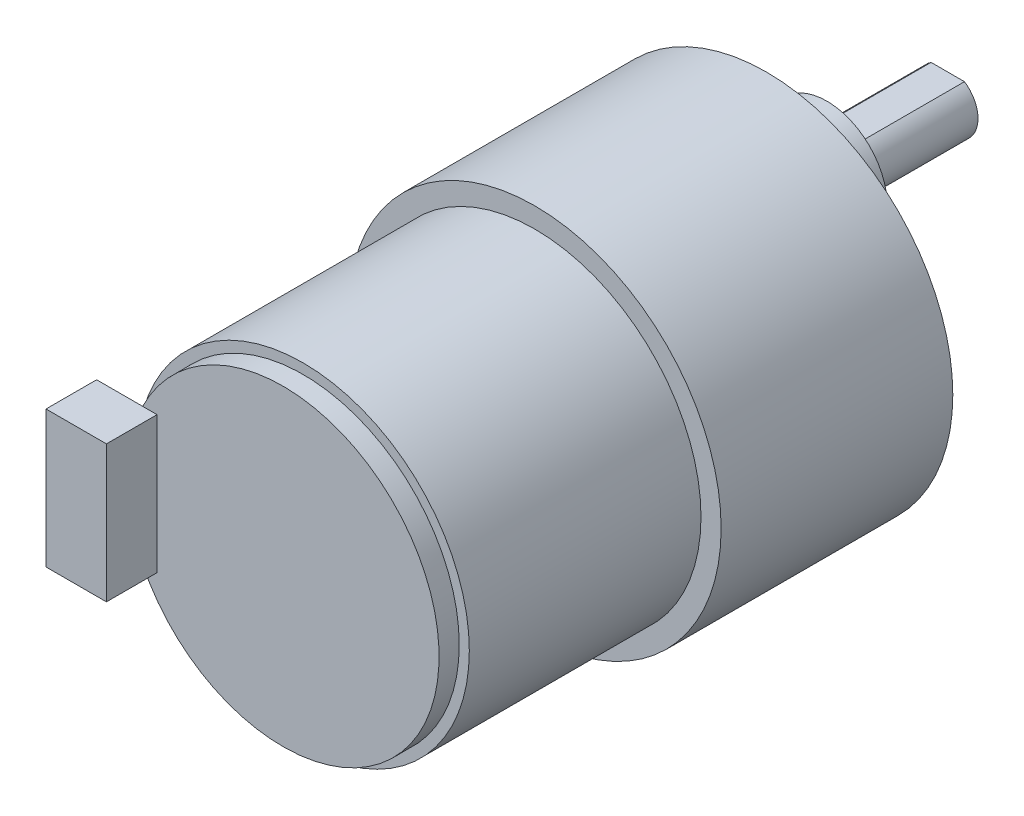
ISO-10303-21;
HEADER;
FILE_DESCRIPTION(('STEP AP214'),'2;1');
FILE_NAME('part.step','',(''),(''),'','','');
FILE_SCHEMA(('AUTOMOTIVE_DESIGN { 1 0 10303 214 1 1 1 1 }'));
ENDSEC;
DATA;
#1=APPLICATION_CONTEXT('core data for automotive mechanical design processes');
#2=APPLICATION_PROTOCOL_DEFINITION('international standard','automotive_design',2000,#1);
#3=PRODUCT_CONTEXT('',#1,'mechanical');
#4=PRODUCT('Part','Part','',(#3));
#5=PRODUCT_RELATED_PRODUCT_CATEGORY('part','',(#4));
#6=PRODUCT_DEFINITION_FORMATION('','',#4);
#7=PRODUCT_DEFINITION_CONTEXT('part definition',#1,'design');
#8=PRODUCT_DEFINITION('design','',#6,#7);
#9=PRODUCT_DEFINITION_SHAPE('','',#8);
#10=(LENGTH_UNIT() NAMED_UNIT(*) SI_UNIT(.MILLI.,.METRE.));
#11=(NAMED_UNIT(*) PLANE_ANGLE_UNIT() SI_UNIT($,.RADIAN.));
#12=(NAMED_UNIT(*) SI_UNIT($,.STERADIAN.) SOLID_ANGLE_UNIT());
#13=UNCERTAINTY_MEASURE_WITH_UNIT(LENGTH_MEASURE(1.E-05),#10,'distance_accuracy_value','');
#14=(GEOMETRIC_REPRESENTATION_CONTEXT(3) GLOBAL_UNCERTAINTY_ASSIGNED_CONTEXT((#13)) GLOBAL_UNIT_ASSIGNED_CONTEXT((#10,
#11,#12)) REPRESENTATION_CONTEXT('',''));
#15=CARTESIAN_POINT('',(0.,0.,0.));
#16=DIRECTION('',(0.,0.,1.));
#17=DIRECTION('',(1.,0.,0.));
#18=AXIS2_PLACEMENT_3D('',#15,#16,#17);
#19=CARTESIAN_POINT('',(0.,0.,2.));
#20=DIRECTION('',(0.,0.,1.));
#21=DIRECTION('',(1.,0.,0.));
#22=AXIS2_PLACEMENT_3D('',#19,#20,#21);
#23=PLANE('',#22);
#24=DIRECTION('',(0.,1.,0.));
#25=VECTOR('',#24,1.);
#26=CARTESIAN_POINT('',(-12.5,-6.7929235261488,2.));
#27=LINE('',#26,#25);
#28=CARTESIAN_POINT('',(-12.5,-6.7929235261488,2.));
#29=VERTEX_POINT('',#28);
#30=CARTESIAN_POINT('',(-12.5,6.7929235261488,2.));
#31=VERTEX_POINT('',#30);
#32=EDGE_CURVE('E56',#29,#31,#27,.T.);
#33=ORIENTED_EDGE('',*,*,#32,.F.);
#34=DIRECTION('',(-1.,0.,0.));
#35=VECTOR('',#34,1.);
#36=CARTESIAN_POINT('',(-12.5,-6.7929235261488,2.));
#37=LINE('',#36,#35);
#38=CARTESIAN_POINT('',(-13.9321997533733,-6.7929235261488,2.));
#39=VERTEX_POINT('',#38);
#40=EDGE_CURVE('E61',#29,#39,#37,.T.);
#41=ORIENTED_EDGE('',*,*,#40,.T.);
#42=CARTESIAN_POINT('',(0.,0.,2.));
#43=DIRECTION('',(0.,0.,1.));
#44=DIRECTION('',(1.,0.,0.));
#45=AXIS2_PLACEMENT_3D('',#42,#43,#44);
#46=CIRCLE('',#45,15.5);
#47=CARTESIAN_POINT('',(-13.9321997533733,6.7929235261488,2.));
#48=VERTEX_POINT('',#47);
#49=EDGE_CURVE('E155',#39,#48,#46,.T.);
#50=ORIENTED_EDGE('',*,*,#49,.T.);
#51=DIRECTION('',(-1.,0.,0.));
#52=VECTOR('',#51,1.);
#53=CARTESIAN_POINT('',(-12.5,6.7929235261488,2.));
#54=LINE('',#53,#52);
#55=EDGE_CURVE('E143',#31,#48,#54,.T.);
#56=ORIENTED_EDGE('',*,*,#55,.F.);
#57=EDGE_LOOP('',(#33,#41,#50,#56));
#58=FACE_BOUND('',#57,.T.);
#59=ADVANCED_FACE('F40',(#58),#23,.T.);
#60=CARTESIAN_POINT('',(0.,0.,-23.));
#61=DIRECTION('',(0.,0.,1.));
#62=DIRECTION('',(1.,0.,0.));
#63=AXIS2_PLACEMENT_3D('',#60,#61,#62);
#64=CYLINDRICAL_SURFACE('',#63,16.5);
#65=CARTESIAN_POINT('',(0.,0.,-23.));
#66=DIRECTION('',(0.,0.,1.));
#67=DIRECTION('',(1.,0.,0.));
#68=AXIS2_PLACEMENT_3D('',#65,#66,#67);
#69=CIRCLE('',#68,16.5);
#70=CARTESIAN_POINT('',(16.5,0.,-23.));
#71=VERTEX_POINT('',#70);
#72=EDGE_CURVE('E244',#71,#71,#69,.T.);
#73=ORIENTED_EDGE('',*,*,#72,.T.);
#74=EDGE_LOOP('',(#73));
#75=FACE_BOUND('',#74,.T.);
#76=CARTESIAN_POINT('',(0.,0.,0.));
#77=DIRECTION('',(0.,0.,1.));
#78=DIRECTION('',(1.,0.,0.));
#79=AXIS2_PLACEMENT_3D('',#76,#77,#78);
#80=CIRCLE('',#79,16.5);
#81=CARTESIAN_POINT('',(16.5,0.,0.));
#82=VERTEX_POINT('',#81);
#83=EDGE_CURVE('E44',#82,#82,#80,.T.);
#84=ORIENTED_EDGE('',*,*,#83,.F.);
#85=EDGE_LOOP('',(#84));
#86=FACE_BOUND('',#85,.T.);
#87=ADVANCED_FACE('F42',(#75,#86),#64,.T.);
#88=CARTESIAN_POINT('',(0.,0.,0.));
#89=DIRECTION('',(0.,0.,1.));
#90=DIRECTION('',(1.,0.,0.));
#91=AXIS2_PLACEMENT_3D('',#88,#89,#90);
#92=PLANE('',#91);
#93=CARTESIAN_POINT('',(0.,0.,0.));
#94=DIRECTION('',(0.,0.,1.));
#95=DIRECTION('',(1.,0.,0.));
#96=AXIS2_PLACEMENT_3D('',#93,#94,#95);
#97=CIRCLE('',#96,15.5);
#98=CARTESIAN_POINT('',(15.5,0.,0.));
#99=VERTEX_POINT('',#98);
#100=EDGE_CURVE('E11',#99,#99,#97,.T.);
#101=ORIENTED_EDGE('',*,*,#100,.F.);
#102=EDGE_LOOP('',(#101));
#103=FACE_BOUND('',#102,.T.);
#104=ORIENTED_EDGE('',*,*,#83,.T.);
#105=EDGE_LOOP('',(#104));
#106=FACE_BOUND('',#105,.T.);
#107=ADVANCED_FACE('F252',(#103,#106),#92,.T.);
#108=CARTESIAN_POINT('',(0.,0.,-46.));
#109=DIRECTION('',(0.,0.,1.));
#110=DIRECTION('',(1.,0.,0.));
#111=AXIS2_PLACEMENT_3D('',#108,#109,#110);
#112=CYLINDRICAL_SURFACE('',#111,18.5);
#113=CARTESIAN_POINT('',(0.,0.,-46.));
#114=DIRECTION('',(0.,0.,-1.));
#115=DIRECTION('',(-1.,0.,0.));
#116=AXIS2_PLACEMENT_3D('',#113,#114,#115);
#117=CIRCLE('',#116,18.5);
#118=CARTESIAN_POINT('',(-18.5,0.,-46.));
#119=VERTEX_POINT('',#118);
#120=EDGE_CURVE('E241',#119,#119,#117,.T.);
#121=ORIENTED_EDGE('',*,*,#120,.F.);
#122=EDGE_LOOP('',(#121));
#123=FACE_BOUND('',#122,.T.);
#124=CARTESIAN_POINT('',(0.,0.,-23.));
#125=DIRECTION('',(0.,0.,-1.));
#126=DIRECTION('',(-1.,0.,0.));
#127=AXIS2_PLACEMENT_3D('',#124,#125,#126);
#128=CIRCLE('',#127,18.5);
#129=CARTESIAN_POINT('',(-18.5,0.,-23.));
#130=VERTEX_POINT('',#129);
#131=EDGE_CURVE('E238',#130,#130,#128,.T.);
#132=ORIENTED_EDGE('',*,*,#131,.T.);
#133=EDGE_LOOP('',(#132));
#134=FACE_BOUND('',#133,.T.);
#135=ADVANCED_FACE('F259',(#123,#134),#112,.T.);
#136=CARTESIAN_POINT('',(0.,0.,-46.));
#137=DIRECTION('',(0.,0.,-1.));
#138=DIRECTION('',(-1.,0.,0.));
#139=AXIS2_PLACEMENT_3D('',#136,#137,#138);
#140=PLANE('',#139);
#141=CARTESIAN_POINT('',(-7.75000000000016,-13.4233937586587,-46.));
#142=DIRECTION('',(0.,0.,-1.));
#143=DIRECTION('',(-1.,0.,0.));
#144=AXIS2_PLACEMENT_3D('',#141,#142,#143);
#145=CIRCLE('',#144,1.525);
#146=CARTESIAN_POINT('',(-9.27500000000016,-13.4233937586587,-46.));
#147=VERTEX_POINT('',#146);
#148=EDGE_CURVE('E162',#147,#147,#145,.T.);
#149=ORIENTED_EDGE('',*,*,#148,.F.);
#150=EDGE_LOOP('',(#149));
#151=FACE_BOUND('',#150,.T.);
#152=CARTESIAN_POINT('',(7.74999999999987,-13.4233937586589,-46.));
#153=DIRECTION('',(0.,0.,-1.));
#154=DIRECTION('',(-1.,0.,0.));
#155=AXIS2_PLACEMENT_3D('',#152,#153,#154);
#156=CIRCLE('',#155,1.525);
#157=CARTESIAN_POINT('',(6.22499999999987,-13.4233937586589,-46.));
#158=VERTEX_POINT('',#157);
#159=EDGE_CURVE('E172',#158,#158,#156,.T.);
#160=ORIENTED_EDGE('',*,*,#159,.F.);
#161=EDGE_LOOP('',(#160));
#162=FACE_BOUND('',#161,.T.);
#163=CARTESIAN_POINT('',(15.5,0.,-46.));
#164=DIRECTION('',(0.,0.,-1.));
#165=DIRECTION('',(-1.,0.,0.));
#166=AXIS2_PLACEMENT_3D('',#163,#164,#165);
#167=CIRCLE('',#166,1.525);
#168=CARTESIAN_POINT('',(13.975,0.,-46.));
#169=VERTEX_POINT('',#168);
#170=EDGE_CURVE('E181',#169,#169,#167,.T.);
#171=ORIENTED_EDGE('',*,*,#170,.F.);
#172=EDGE_LOOP('',(#171));
#173=FACE_BOUND('',#172,.T.);
#174=CARTESIAN_POINT('',(7.75000000000006,13.4233937586588,-46.));
#175=DIRECTION('',(0.,0.,-1.));
#176=DIRECTION('',(-1.,0.,0.));
#177=AXIS2_PLACEMENT_3D('',#174,#175,#176);
#178=CIRCLE('',#177,1.525);
#179=CARTESIAN_POINT('',(6.22500000000006,13.4233937586588,-46.));
#180=VERTEX_POINT('',#179);
#181=EDGE_CURVE('E190',#180,#180,#178,.T.);
#182=ORIENTED_EDGE('',*,*,#181,.F.);
#183=EDGE_LOOP('',(#182));
#184=FACE_BOUND('',#183,.T.);
#185=CARTESIAN_POINT('',(-7.74999999999997,13.4233937586588,-46.));
#186=DIRECTION('',(0.,0.,-1.));
#187=DIRECTION('',(-1.,0.,0.));
#188=AXIS2_PLACEMENT_3D('',#185,#186,#187);
#189=CIRCLE('',#188,1.525);
#190=CARTESIAN_POINT('',(-9.27499999999997,13.4233937586588,-46.));
#191=VERTEX_POINT('',#190);
#192=EDGE_CURVE('E199',#191,#191,#189,.T.);
#193=ORIENTED_EDGE('',*,*,#192,.F.);
#194=EDGE_LOOP('',(#193));
#195=FACE_BOUND('',#194,.T.);
#196=CARTESIAN_POINT('',(-15.5,0.,-46.));
#197=DIRECTION('',(0.,0.,-1.));
#198=DIRECTION('',(-1.,0.,0.));
#199=AXIS2_PLACEMENT_3D('',#196,#197,#198);
#200=CIRCLE('',#199,1.525);
#201=CARTESIAN_POINT('',(-17.025,0.,-46.));
#202=VERTEX_POINT('',#201);
#203=EDGE_CURVE('E208',#202,#202,#200,.T.);
#204=ORIENTED_EDGE('',*,*,#203,.F.);
#205=EDGE_LOOP('',(#204));
#206=FACE_BOUND('',#205,.T.);
#207=CARTESIAN_POINT('',(0.,7.,-46.));
#208=DIRECTION('',(0.,0.,-1.));
#209=DIRECTION('',(-1.,0.,0.));
#210=AXIS2_PLACEMENT_3D('',#207,#208,#209);
#211=CIRCLE('',#210,6.);
#212=CARTESIAN_POINT('',(-6.,7.,-46.));
#213=VERTEX_POINT('',#212);
#214=EDGE_CURVE('E234',#213,#213,#211,.T.);
#215=ORIENTED_EDGE('',*,*,#214,.F.);
#216=EDGE_LOOP('',(#215));
#217=FACE_BOUND('',#216,.T.);
#218=ORIENTED_EDGE('',*,*,#120,.T.);
#219=EDGE_LOOP('',(#218));
#220=FACE_BOUND('',#219,.T.);
#221=ADVANCED_FACE('F364',(#151,#162,#173,#184,#195,#206,#217,#220),#140,.T.);
#222=CARTESIAN_POINT('',(0.,0.,-23.));
#223=DIRECTION('',(0.,0.,-1.));
#224=DIRECTION('',(-1.,0.,0.));
#225=AXIS2_PLACEMENT_3D('',#222,#223,#224);
#226=PLANE('',#225);
#227=ORIENTED_EDGE('',*,*,#72,.F.);
#228=EDGE_LOOP('',(#227));
#229=FACE_BOUND('',#228,.T.);
#230=ORIENTED_EDGE('',*,*,#131,.F.);
#231=EDGE_LOOP('',(#230));
#232=FACE_BOUND('',#231,.T.);
#233=ADVANCED_FACE('F362',(#229,#232),#226,.F.);
#234=CARTESIAN_POINT('',(0.,7.,-52.));
#235=DIRECTION('',(0.,0.,1.));
#236=DIRECTION('',(1.,0.,0.));
#237=AXIS2_PLACEMENT_3D('',#234,#235,#236);
#238=CYLINDRICAL_SURFACE('',#237,6.);
#239=CARTESIAN_POINT('',(0.,7.,-52.));
#240=DIRECTION('',(0.,0.,-1.));
#241=DIRECTION('',(-1.,0.,0.));
#242=AXIS2_PLACEMENT_3D('',#239,#240,#241);
#243=CIRCLE('',#242,6.);
#244=CARTESIAN_POINT('',(-6.,7.,-52.));
#245=VERTEX_POINT('',#244);
#246=EDGE_CURVE('E235',#245,#245,#243,.T.);
#247=ORIENTED_EDGE('',*,*,#246,.F.);
#248=EDGE_LOOP('',(#247));
#249=FACE_BOUND('',#248,.T.);
#250=ORIENTED_EDGE('',*,*,#214,.T.);
#251=EDGE_LOOP('',(#250));
#252=FACE_BOUND('',#251,.T.);
#253=ADVANCED_FACE('F358',(#249,#252),#238,.T.);
#254=CARTESIAN_POINT('',(0.,7.,-52.));
#255=DIRECTION('',(0.,0.,-1.));
#256=DIRECTION('',(-1.,0.,0.));
#257=AXIS2_PLACEMENT_3D('',#254,#255,#256);
#258=PLANE('',#257);
#259=CARTESIAN_POINT('',(0.,7.,-52.));
#260=DIRECTION('',(0.,0.,-1.));
#261=DIRECTION('',(-1.,0.,0.));
#262=AXIS2_PLACEMENT_3D('',#259,#260,#261);
#263=CIRCLE('',#262,3.);
#264=CARTESIAN_POINT('',(1.6583123951777,9.5,-52.));
#265=VERTEX_POINT('',#264);
#266=CARTESIAN_POINT('',(-1.6583123951777,9.5,-52.));
#267=VERTEX_POINT('',#266);
#268=EDGE_CURVE('E217',#265,#267,#263,.T.);
#269=ORIENTED_EDGE('',*,*,#268,.F.);
#270=DIRECTION('',(1.,0.,0.));
#271=VECTOR('',#270,1.);
#272=CARTESIAN_POINT('',(1.6583123951777,9.5,-52.));
#273=LINE('',#272,#271);
#274=EDGE_CURVE('E222',#267,#265,#273,.T.);
#275=ORIENTED_EDGE('',*,*,#274,.F.);
#276=EDGE_LOOP('',(#269,#275));
#277=FACE_BOUND('',#276,.T.);
#278=ORIENTED_EDGE('',*,*,#246,.T.);
#279=EDGE_LOOP('',(#278));
#280=FACE_BOUND('',#279,.T.);
#281=ADVANCED_FACE('F354',(#277,#280),#258,.T.);
#282=CARTESIAN_POINT('',(0.,7.,-64.));
#283=DIRECTION('',(0.,0.,1.));
#284=DIRECTION('',(1.,0.,0.));
#285=AXIS2_PLACEMENT_3D('',#282,#283,#284);
#286=CYLINDRICAL_SURFACE('',#285,3.);
#287=ORIENTED_EDGE('',*,*,#268,.T.);
#288=DIRECTION('',(0.,0.,1.));
#289=VECTOR('',#288,1.);
#290=CARTESIAN_POINT('',(-1.6583123951777,9.5,-64.));
#291=LINE('',#290,#289);
#292=CARTESIAN_POINT('',(-1.6583123951777,9.5,-64.));
#293=VERTEX_POINT('',#292);
#294=EDGE_CURVE('E231',#293,#267,#291,.T.);
#295=ORIENTED_EDGE('',*,*,#294,.F.);
#296=CARTESIAN_POINT('',(0.,7.,-64.));
#297=DIRECTION('',(0.,0.,-1.));
#298=DIRECTION('',(-1.,0.,0.));
#299=AXIS2_PLACEMENT_3D('',#296,#297,#298);
#300=CIRCLE('',#299,3.);
#301=CARTESIAN_POINT('',(1.6583123951777,9.5,-64.));
#302=VERTEX_POINT('',#301);
#303=EDGE_CURVE('E218',#302,#293,#300,.T.);
#304=ORIENTED_EDGE('',*,*,#303,.F.);
#305=DIRECTION('',(0.,0.,1.));
#306=VECTOR('',#305,1.);
#307=CARTESIAN_POINT('',(1.6583123951777,9.5,-64.));
#308=LINE('',#307,#306);
#309=EDGE_CURVE('E224',#302,#265,#308,.T.);
#310=ORIENTED_EDGE('',*,*,#309,.T.);
#311=EDGE_LOOP('',(#287,#295,#304,#310));
#312=FACE_BOUND('',#311,.T.);
#313=ADVANCED_FACE('F350',(#312),#286,.T.);
#314=CARTESIAN_POINT('',(1.6583123951777,9.5,-64.));
#315=DIRECTION('',(0.,-1.,0.));
#316=DIRECTION('',(0.,0.,-1.));
#317=AXIS2_PLACEMENT_3D('',#314,#315,#316);
#318=PLANE('',#317);
#319=ORIENTED_EDGE('',*,*,#274,.T.);
#320=ORIENTED_EDGE('',*,*,#309,.F.);
#321=DIRECTION('',(1.,0.,0.));
#322=VECTOR('',#321,1.);
#323=CARTESIAN_POINT('',(1.6583123951777,9.5,-64.));
#324=LINE('',#323,#322);
#325=EDGE_CURVE('E221',#293,#302,#324,.T.);
#326=ORIENTED_EDGE('',*,*,#325,.F.);
#327=ORIENTED_EDGE('',*,*,#294,.T.);
#328=EDGE_LOOP('',(#319,#320,#326,#327));
#329=FACE_BOUND('',#328,.T.);
#330=ADVANCED_FACE('F346',(#329),#318,.F.);
#331=CARTESIAN_POINT('',(0.,7.,-64.));
#332=DIRECTION('',(0.,0.,-1.));
#333=DIRECTION('',(-1.,0.,0.));
#334=AXIS2_PLACEMENT_3D('',#331,#332,#333);
#335=PLANE('',#334);
#336=ORIENTED_EDGE('',*,*,#303,.T.);
#337=ORIENTED_EDGE('',*,*,#325,.T.);
#338=EDGE_LOOP('',(#336,#337));
#339=FACE_BOUND('',#338,.T.);
#340=ADVANCED_FACE('F342',(#339),#335,.T.);
#341=CARTESIAN_POINT('',(-15.5,0.,-35.9999946));
#342=DIRECTION('',(0.,0.,-1.));
#343=DIRECTION('',(-1.,0.,0.));
#344=AXIS2_PLACEMENT_3D('',#341,#342,#343);
#345=CONICAL_SURFACE('',#344,1.25,1.02974425867665);
#346=CARTESIAN_POINT('',(-15.5,0.,-35.2489188262155));
#347=VERTEX_POINT('',#346);
#348=VERTEX_LOOP('',#347);
#349=FACE_BOUND('',#348,.T.);
#350=CARTESIAN_POINT('',(-15.5,0.,-35.9999946));
#351=DIRECTION('',(0.,0.,-1.));
#352=DIRECTION('',(-1.,0.,0.));
#353=AXIS2_PLACEMENT_3D('',#350,#351,#352);
#354=CIRCLE('',#353,1.25);
#355=CARTESIAN_POINT('',(-16.75,0.,-35.9999946));
#356=VERTEX_POINT('',#355);
#357=EDGE_CURVE('E214',#356,#356,#354,.T.);
#358=ORIENTED_EDGE('',*,*,#357,.T.);
#359=EDGE_LOOP('',(#358));
#360=FACE_BOUND('',#359,.T.);
#361=ADVANCED_FACE('F338',(#349,#360),#345,.F.);
#362=CARTESIAN_POINT('',(-15.5,0.,-46.));
#363=DIRECTION('',(0.,0.,-1.));
#364=DIRECTION('',(-1.,0.,0.));
#365=AXIS2_PLACEMENT_3D('',#362,#363,#364);
#366=CYLINDRICAL_SURFACE('',#365,1.25);
#367=ORIENTED_EDGE('',*,*,#357,.F.);
#368=EDGE_LOOP('',(#367));
#369=FACE_BOUND('',#368,.T.);
#370=CARTESIAN_POINT('',(-15.5,0.,-45.725));
#371=DIRECTION('',(0.,0.,-1.));
#372=DIRECTION('',(-1.,0.,0.));
#373=AXIS2_PLACEMENT_3D('',#370,#371,#372);
#374=CIRCLE('',#373,1.25);
#375=CARTESIAN_POINT('',(-16.75,0.,-45.725));
#376=VERTEX_POINT('',#375);
#377=EDGE_CURVE('E211',#376,#376,#374,.T.);
#378=ORIENTED_EDGE('',*,*,#377,.T.);
#379=EDGE_LOOP('',(#378));
#380=FACE_BOUND('',#379,.T.);
#381=ADVANCED_FACE('F334',(#369,#380),#366,.F.);
#382=CARTESIAN_POINT('',(-15.5,0.,-46.));
#383=DIRECTION('',(0.,0.,-1.));
#384=DIRECTION('',(-1.,0.,0.));
#385=AXIS2_PLACEMENT_3D('',#382,#383,#384);
#386=CONICAL_SURFACE('',#385,1.525,0.785398163397458);
#387=ORIENTED_EDGE('',*,*,#377,.F.);
#388=EDGE_LOOP('',(#387));
#389=FACE_BOUND('',#388,.T.);
#390=ORIENTED_EDGE('',*,*,#203,.T.);
#391=EDGE_LOOP('',(#390));
#392=FACE_BOUND('',#391,.T.);
#393=ADVANCED_FACE('F330',(#389,#392),#386,.F.);
#394=CARTESIAN_POINT('',(-7.74999999999997,13.4233937586588,-35.9999946));
#395=DIRECTION('',(0.,0.,-1.));
#396=DIRECTION('',(-1.,0.,0.));
#397=AXIS2_PLACEMENT_3D('',#394,#395,#396);
#398=CONICAL_SURFACE('',#397,1.25,1.02974425867665);
#399=CARTESIAN_POINT('',(-7.74999999999997,13.4233937586588,-35.2489188262155));
#400=VERTEX_POINT('',#399);
#401=VERTEX_LOOP('',#400);
#402=FACE_BOUND('',#401,.T.);
#403=CARTESIAN_POINT('',(-7.74999999999997,13.4233937586588,-35.9999946));
#404=DIRECTION('',(0.,0.,-1.));
#405=DIRECTION('',(-1.,0.,0.));
#406=AXIS2_PLACEMENT_3D('',#403,#404,#405);
#407=CIRCLE('',#406,1.25);
#408=CARTESIAN_POINT('',(-8.99999999999997,13.4233937586588,-35.9999946));
#409=VERTEX_POINT('',#408);
#410=EDGE_CURVE('E205',#409,#409,#407,.T.);
#411=ORIENTED_EDGE('',*,*,#410,.T.);
#412=EDGE_LOOP('',(#411));
#413=FACE_BOUND('',#412,.T.);
#414=ADVANCED_FACE('F326',(#402,#413),#398,.F.);
#415=CARTESIAN_POINT('',(-7.74999999999997,13.4233937586588,-46.));
#416=DIRECTION('',(0.,0.,-1.));
#417=DIRECTION('',(-1.,0.,0.));
#418=AXIS2_PLACEMENT_3D('',#415,#416,#417);
#419=CYLINDRICAL_SURFACE('',#418,1.25);
#420=ORIENTED_EDGE('',*,*,#410,.F.);
#421=EDGE_LOOP('',(#420));
#422=FACE_BOUND('',#421,.T.);
#423=CARTESIAN_POINT('',(-7.74999999999997,13.4233937586588,-45.725));
#424=DIRECTION('',(0.,0.,-1.));
#425=DIRECTION('',(-1.,0.,0.));
#426=AXIS2_PLACEMENT_3D('',#423,#424,#425);
#427=CIRCLE('',#426,1.25);
#428=CARTESIAN_POINT('',(-8.99999999999997,13.4233937586588,-45.725));
#429=VERTEX_POINT('',#428);
#430=EDGE_CURVE('E202',#429,#429,#427,.T.);
#431=ORIENTED_EDGE('',*,*,#430,.T.);
#432=EDGE_LOOP('',(#431));
#433=FACE_BOUND('',#432,.T.);
#434=ADVANCED_FACE('F322',(#422,#433),#419,.F.);
#435=CARTESIAN_POINT('',(-7.74999999999997,13.4233937586588,-46.));
#436=DIRECTION('',(0.,0.,-1.));
#437=DIRECTION('',(-1.,0.,0.));
#438=AXIS2_PLACEMENT_3D('',#435,#436,#437);
#439=CONICAL_SURFACE('',#438,1.525,0.785398163397456);
#440=ORIENTED_EDGE('',*,*,#430,.F.);
#441=EDGE_LOOP('',(#440));
#442=FACE_BOUND('',#441,.T.);
#443=ORIENTED_EDGE('',*,*,#192,.T.);
#444=EDGE_LOOP('',(#443));
#445=FACE_BOUND('',#444,.T.);
#446=ADVANCED_FACE('F318',(#442,#445),#439,.F.);
#447=CARTESIAN_POINT('',(7.75000000000006,13.4233937586588,-35.9999946));
#448=DIRECTION('',(0.,0.,-1.));
#449=DIRECTION('',(-1.,0.,0.));
#450=AXIS2_PLACEMENT_3D('',#447,#448,#449);
#451=CONICAL_SURFACE('',#450,1.25,1.02974425867665);
#452=CARTESIAN_POINT('',(7.75000000000006,13.4233937586588,-35.2489188262155));
#453=VERTEX_POINT('',#452);
#454=VERTEX_LOOP('',#453);
#455=FACE_BOUND('',#454,.T.);
#456=CARTESIAN_POINT('',(7.75000000000006,13.4233937586588,-35.9999946));
#457=DIRECTION('',(0.,0.,-1.));
#458=DIRECTION('',(-1.,0.,0.));
#459=AXIS2_PLACEMENT_3D('',#456,#457,#458);
#460=CIRCLE('',#459,1.25);
#461=CARTESIAN_POINT('',(6.50000000000007,13.4233937586588,-35.9999946));
#462=VERTEX_POINT('',#461);
#463=EDGE_CURVE('E196',#462,#462,#460,.T.);
#464=ORIENTED_EDGE('',*,*,#463,.T.);
#465=EDGE_LOOP('',(#464));
#466=FACE_BOUND('',#465,.T.);
#467=ADVANCED_FACE('F314',(#455,#466),#451,.F.);
#468=CARTESIAN_POINT('',(7.75000000000006,13.4233937586588,-46.));
#469=DIRECTION('',(0.,0.,-1.));
#470=DIRECTION('',(-1.,0.,0.));
#471=AXIS2_PLACEMENT_3D('',#468,#469,#470);
#472=CYLINDRICAL_SURFACE('',#471,1.25);
#473=ORIENTED_EDGE('',*,*,#463,.F.);
#474=EDGE_LOOP('',(#473));
#475=FACE_BOUND('',#474,.T.);
#476=CARTESIAN_POINT('',(7.75000000000006,13.4233937586588,-45.725));
#477=DIRECTION('',(0.,0.,-1.));
#478=DIRECTION('',(-1.,0.,0.));
#479=AXIS2_PLACEMENT_3D('',#476,#477,#478);
#480=CIRCLE('',#479,1.25);
#481=CARTESIAN_POINT('',(6.50000000000006,13.4233937586588,-45.725));
#482=VERTEX_POINT('',#481);
#483=EDGE_CURVE('E193',#482,#482,#480,.T.);
#484=ORIENTED_EDGE('',*,*,#483,.T.);
#485=EDGE_LOOP('',(#484));
#486=FACE_BOUND('',#485,.T.);
#487=ADVANCED_FACE('F310',(#475,#486),#472,.F.);
#488=CARTESIAN_POINT('',(7.75000000000006,13.4233937586588,-46.));
#489=DIRECTION('',(0.,0.,-1.));
#490=DIRECTION('',(-1.,0.,0.));
#491=AXIS2_PLACEMENT_3D('',#488,#489,#490);
#492=CONICAL_SURFACE('',#491,1.525,0.785398163397458);
#493=ORIENTED_EDGE('',*,*,#483,.F.);
#494=EDGE_LOOP('',(#493));
#495=FACE_BOUND('',#494,.T.);
#496=ORIENTED_EDGE('',*,*,#181,.T.);
#497=EDGE_LOOP('',(#496));
#498=FACE_BOUND('',#497,.T.);
#499=ADVANCED_FACE('F306',(#495,#498),#492,.F.);
#500=CARTESIAN_POINT('',(15.5,0.,-35.9999946));
#501=DIRECTION('',(0.,0.,-1.));
#502=DIRECTION('',(-1.,0.,0.));
#503=AXIS2_PLACEMENT_3D('',#500,#501,#502);
#504=CONICAL_SURFACE('',#503,1.25,1.02974425867665);
#505=CARTESIAN_POINT('',(15.5,0.,-35.2489188262155));
#506=VERTEX_POINT('',#505);
#507=VERTEX_LOOP('',#506);
#508=FACE_BOUND('',#507,.T.);
#509=CARTESIAN_POINT('',(15.5,0.,-35.9999946));
#510=DIRECTION('',(0.,0.,-1.));
#511=DIRECTION('',(-1.,0.,0.));
#512=AXIS2_PLACEMENT_3D('',#509,#510,#511);
#513=CIRCLE('',#512,1.25);
#514=CARTESIAN_POINT('',(14.25,0.,-35.9999946));
#515=VERTEX_POINT('',#514);
#516=EDGE_CURVE('E187',#515,#515,#513,.T.);
#517=ORIENTED_EDGE('',*,*,#516,.T.);
#518=EDGE_LOOP('',(#517));
#519=FACE_BOUND('',#518,.T.);
#520=ADVANCED_FACE('F302',(#508,#519),#504,.F.);
#521=CARTESIAN_POINT('',(15.5,0.,-46.));
#522=DIRECTION('',(0.,0.,-1.));
#523=DIRECTION('',(-1.,0.,0.));
#524=AXIS2_PLACEMENT_3D('',#521,#522,#523);
#525=CYLINDRICAL_SURFACE('',#524,1.25);
#526=ORIENTED_EDGE('',*,*,#516,.F.);
#527=EDGE_LOOP('',(#526));
#528=FACE_BOUND('',#527,.T.);
#529=CARTESIAN_POINT('',(15.5,0.,-45.725));
#530=DIRECTION('',(0.,0.,-1.));
#531=DIRECTION('',(-1.,0.,0.));
#532=AXIS2_PLACEMENT_3D('',#529,#530,#531);
#533=CIRCLE('',#532,1.25);
#534=CARTESIAN_POINT('',(14.25,0.,-45.725));
#535=VERTEX_POINT('',#534);
#536=EDGE_CURVE('E184',#535,#535,#533,.T.);
#537=ORIENTED_EDGE('',*,*,#536,.T.);
#538=EDGE_LOOP('',(#537));
#539=FACE_BOUND('',#538,.T.);
#540=ADVANCED_FACE('F298',(#528,#539),#525,.F.);
#541=CARTESIAN_POINT('',(15.5,0.,-46.));
#542=DIRECTION('',(0.,0.,-1.));
#543=DIRECTION('',(-1.,0.,0.));
#544=AXIS2_PLACEMENT_3D('',#541,#542,#543);
#545=CONICAL_SURFACE('',#544,1.525,0.785398163397455);
#546=ORIENTED_EDGE('',*,*,#536,.F.);
#547=EDGE_LOOP('',(#546));
#548=FACE_BOUND('',#547,.T.);
#549=ORIENTED_EDGE('',*,*,#170,.T.);
#550=EDGE_LOOP('',(#549));
#551=FACE_BOUND('',#550,.T.);
#552=ADVANCED_FACE('F294',(#548,#551),#545,.F.);
#553=CARTESIAN_POINT('',(7.74999999999987,-13.4233937586589,-35.9999946));
#554=DIRECTION('',(0.,0.,-1.));
#555=DIRECTION('',(-1.,0.,0.));
#556=AXIS2_PLACEMENT_3D('',#553,#554,#555);
#557=CONICAL_SURFACE('',#556,1.25,1.02974425867665);
#558=CARTESIAN_POINT('',(7.74999999999987,-13.4233937586589,-35.2489188262155));
#559=VERTEX_POINT('',#558);
#560=VERTEX_LOOP('',#559);
#561=FACE_BOUND('',#560,.T.);
#562=CARTESIAN_POINT('',(7.74999999999987,-13.4233937586589,-35.9999946));
#563=DIRECTION('',(0.,0.,-1.));
#564=DIRECTION('',(-1.,0.,0.));
#565=AXIS2_PLACEMENT_3D('',#562,#563,#564);
#566=CIRCLE('',#565,1.25);
#567=CARTESIAN_POINT('',(6.49999999999988,-13.4233937586589,-35.9999946));
#568=VERTEX_POINT('',#567);
#569=EDGE_CURVE('E178',#568,#568,#566,.T.);
#570=ORIENTED_EDGE('',*,*,#569,.T.);
#571=EDGE_LOOP('',(#570));
#572=FACE_BOUND('',#571,.T.);
#573=ADVANCED_FACE('F290',(#561,#572),#557,.F.);
#574=CARTESIAN_POINT('',(7.74999999999987,-13.4233937586589,-46.));
#575=DIRECTION('',(0.,0.,-1.));
#576=DIRECTION('',(-1.,0.,0.));
#577=AXIS2_PLACEMENT_3D('',#574,#575,#576);
#578=CYLINDRICAL_SURFACE('',#577,1.25);
#579=ORIENTED_EDGE('',*,*,#569,.F.);
#580=EDGE_LOOP('',(#579));
#581=FACE_BOUND('',#580,.T.);
#582=CARTESIAN_POINT('',(7.74999999999987,-13.4233937586589,-45.725));
#583=DIRECTION('',(0.,0.,-1.));
#584=DIRECTION('',(-1.,0.,0.));
#585=AXIS2_PLACEMENT_3D('',#582,#583,#584);
#586=CIRCLE('',#585,1.25);
#587=CARTESIAN_POINT('',(6.49999999999988,-13.4233937586589,-45.725));
#588=VERTEX_POINT('',#587);
#589=EDGE_CURVE('E175',#588,#588,#586,.T.);
#590=ORIENTED_EDGE('',*,*,#589,.T.);
#591=EDGE_LOOP('',(#590));
#592=FACE_BOUND('',#591,.T.);
#593=ADVANCED_FACE('F286',(#581,#592),#578,.F.);
#594=CARTESIAN_POINT('',(7.74999999999987,-13.4233937586589,-46.));
#595=DIRECTION('',(0.,0.,-1.));
#596=DIRECTION('',(-1.,0.,0.));
#597=AXIS2_PLACEMENT_3D('',#594,#595,#596);
#598=CONICAL_SURFACE('',#597,1.525,0.785398163397458);
#599=ORIENTED_EDGE('',*,*,#589,.F.);
#600=EDGE_LOOP('',(#599));
#601=FACE_BOUND('',#600,.T.);
#602=ORIENTED_EDGE('',*,*,#159,.T.);
#603=EDGE_LOOP('',(#602));
#604=FACE_BOUND('',#603,.T.);
#605=ADVANCED_FACE('F282',(#601,#604),#598,.F.);
#606=CARTESIAN_POINT('',(-7.75000000000016,-13.4233937586587,-35.9999946));
#607=DIRECTION('',(0.,0.,-1.));
#608=DIRECTION('',(-1.,0.,0.));
#609=AXIS2_PLACEMENT_3D('',#606,#607,#608);
#610=CONICAL_SURFACE('',#609,1.25,1.02974425867665);
#611=CARTESIAN_POINT('',(-7.75000000000016,-13.4233937586587,-35.2489188262155));
#612=VERTEX_POINT('',#611);
#613=VERTEX_LOOP('',#612);
#614=FACE_BOUND('',#613,.T.);
#615=CARTESIAN_POINT('',(-7.75000000000016,-13.4233937586587,-35.9999946));
#616=DIRECTION('',(0.,0.,-1.));
#617=DIRECTION('',(-1.,0.,0.));
#618=AXIS2_PLACEMENT_3D('',#615,#616,#617);
#619=CIRCLE('',#618,1.25);
#620=CARTESIAN_POINT('',(-9.00000000000015,-13.4233937586587,-35.9999946));
#621=VERTEX_POINT('',#620);
#622=EDGE_CURVE('E169',#621,#621,#619,.T.);
#623=ORIENTED_EDGE('',*,*,#622,.T.);
#624=EDGE_LOOP('',(#623));
#625=FACE_BOUND('',#624,.T.);
#626=ADVANCED_FACE('F278',(#614,#625),#610,.F.);
#627=CARTESIAN_POINT('',(-7.75000000000016,-13.4233937586587,-46.));
#628=DIRECTION('',(0.,0.,-1.));
#629=DIRECTION('',(-1.,0.,0.));
#630=AXIS2_PLACEMENT_3D('',#627,#628,#629);
#631=CYLINDRICAL_SURFACE('',#630,1.25);
#632=ORIENTED_EDGE('',*,*,#622,.F.);
#633=EDGE_LOOP('',(#632));
#634=FACE_BOUND('',#633,.T.);
#635=CARTESIAN_POINT('',(-7.75000000000016,-13.4233937586587,-45.725));
#636=DIRECTION('',(0.,0.,-1.));
#637=DIRECTION('',(-1.,0.,0.));
#638=AXIS2_PLACEMENT_3D('',#635,#636,#637);
#639=CIRCLE('',#638,1.25);
#640=CARTESIAN_POINT('',(-9.00000000000016,-13.4233937586587,-45.725));
#641=VERTEX_POINT('',#640);
#642=EDGE_CURVE('E166',#641,#641,#639,.T.);
#643=ORIENTED_EDGE('',*,*,#642,.T.);
#644=EDGE_LOOP('',(#643));
#645=FACE_BOUND('',#644,.T.);
#646=ADVANCED_FACE('F274',(#634,#645),#631,.F.);
#647=CARTESIAN_POINT('',(-7.75000000000016,-13.4233937586587,-46.));
#648=DIRECTION('',(0.,0.,-1.));
#649=DIRECTION('',(-1.,0.,0.));
#650=AXIS2_PLACEMENT_3D('',#647,#648,#649);
#651=CONICAL_SURFACE('',#650,1.525,0.785398163397456);
#652=ORIENTED_EDGE('',*,*,#642,.F.);
#653=EDGE_LOOP('',(#652));
#654=FACE_BOUND('',#653,.T.);
#655=ORIENTED_EDGE('',*,*,#148,.T.);
#656=EDGE_LOOP('',(#655));
#657=FACE_BOUND('',#656,.T.);
#658=ADVANCED_FACE('F270',(#654,#657),#651,.F.);
#659=CARTESIAN_POINT('',(0.,0.,2.));
#660=DIRECTION('',(0.,0.,-1.));
#661=DIRECTION('',(-1.,0.,0.));
#662=AXIS2_PLACEMENT_3D('',#659,#660,#661);
#663=CYLINDRICAL_SURFACE('',#662,15.5);
#664=EDGE_CURVE('E160',#48,#39,#46,.T.);
#665=ORIENTED_EDGE('',*,*,#664,.F.);
#666=ORIENTED_EDGE('',*,*,#49,.F.);
#667=EDGE_LOOP('',(#665,#666));
#668=FACE_BOUND('',#667,.T.);
#669=ORIENTED_EDGE('',*,*,#100,.T.);
#670=EDGE_LOOP('',(#669));
#671=FACE_BOUND('',#670,.T.);
#672=ADVANCED_FACE('F267',(#668,#671),#663,.T.);
#673=CARTESIAN_POINT('',(-12.5,-6.7929235261488,7.02500011));
#674=DIRECTION('',(0.,-1.,0.));
#675=DIRECTION('',(0.,0.,-1.));
#676=AXIS2_PLACEMENT_3D('',#673,#674,#675);
#677=PLANE('',#676);
#678=ORIENTED_EDGE('',*,*,#40,.F.);
#679=DIRECTION('',(0.,0.,-1.));
#680=VECTOR('',#679,1.);
#681=CARTESIAN_POINT('',(-12.5,-6.7929235261488,7.02500011));
#682=LINE('',#681,#680);
#683=CARTESIAN_POINT('',(-12.5,-6.7929235261488,7.02500011));
#684=VERTEX_POINT('',#683);
#685=EDGE_CURVE('E140',#684,#29,#682,.T.);
#686=ORIENTED_EDGE('',*,*,#685,.F.);
#687=DIRECTION('',(-1.,0.,0.));
#688=VECTOR('',#687,1.);
#689=CARTESIAN_POINT('',(-12.5,-6.7929235261488,7.02500011));
#690=LINE('',#689,#688);
#691=CARTESIAN_POINT('',(-18.5,-6.7929235261488,7.02500011));
#692=VERTEX_POINT('',#691);
#693=EDGE_CURVE('E134',#684,#692,#690,.T.);
#694=ORIENTED_EDGE('',*,*,#693,.T.);
#695=DIRECTION('',(0.,0.,-1.));
#696=VECTOR('',#695,1.);
#697=CARTESIAN_POINT('',(-18.5,-6.7929235261488,7.02500011));
#698=LINE('',#697,#696);
#699=CARTESIAN_POINT('',(-18.5,-6.7929235261488,2.));
#700=VERTEX_POINT('',#699);
#701=EDGE_CURVE('E118',#692,#700,#698,.T.);
#702=ORIENTED_EDGE('',*,*,#701,.T.);
#703=EDGE_CURVE('E149',#39,#700,#37,.T.);
#704=ORIENTED_EDGE('',*,*,#703,.F.);
#705=EDGE_LOOP('',(#678,#686,#694,#702,#704));
#706=FACE_BOUND('',#705,.T.);
#707=ADVANCED_FACE('F139',(#706),#677,.T.);
#708=CARTESIAN_POINT('',(-12.5,-6.7929235261488,7.02500011));
#709=DIRECTION('',(-1.,0.,0.));
#710=DIRECTION('',(0.,0.,1.));
#711=AXIS2_PLACEMENT_3D('',#708,#709,#710);
#712=PLANE('',#711);
#713=ORIENTED_EDGE('',*,*,#32,.T.);
#714=DIRECTION('',(0.,0.,-1.));
#715=VECTOR('',#714,1.);
#716=CARTESIAN_POINT('',(-12.5,6.7929235261488,7.02500011));
#717=LINE('',#716,#715);
#718=CARTESIAN_POINT('',(-12.5,6.7929235261488,7.02500011));
#719=VERTEX_POINT('',#718);
#720=EDGE_CURVE('E156',#719,#31,#717,.T.);
#721=ORIENTED_EDGE('',*,*,#720,.F.);
#722=DIRECTION('',(0.,1.,0.));
#723=VECTOR('',#722,1.);
#724=CARTESIAN_POINT('',(-12.5,-6.7929235261488,7.02500011));
#725=LINE('',#724,#723);
#726=EDGE_CURVE('E129',#684,#719,#725,.T.);
#727=ORIENTED_EDGE('',*,*,#726,.F.);
#728=ORIENTED_EDGE('',*,*,#685,.T.);
#729=EDGE_LOOP('',(#713,#721,#727,#728));
#730=FACE_BOUND('',#729,.T.);
#731=ADVANCED_FACE('F494',(#730),#712,.F.);
#732=CARTESIAN_POINT('',(-12.5,6.7929235261488,7.02500011));
#733=DIRECTION('',(0.,-1.,0.));
#734=DIRECTION('',(0.,0.,-1.));
#735=AXIS2_PLACEMENT_3D('',#732,#733,#734);
#736=PLANE('',#735);
#737=ORIENTED_EDGE('',*,*,#55,.T.);
#738=CARTESIAN_POINT('',(-18.5,6.7929235261488,2.));
#739=VERTEX_POINT('',#738);
#740=EDGE_CURVE('E151',#48,#739,#54,.T.);
#741=ORIENTED_EDGE('',*,*,#740,.T.);
#742=DIRECTION('',(0.,0.,-1.));
#743=VECTOR('',#742,1.);
#744=CARTESIAN_POINT('',(-18.5,6.7929235261488,7.02500011));
#745=LINE('',#744,#743);
#746=CARTESIAN_POINT('',(-18.5,6.7929235261488,7.02500011));
#747=VERTEX_POINT('',#746);
#748=EDGE_CURVE('E128',#747,#739,#745,.T.);
#749=ORIENTED_EDGE('',*,*,#748,.F.);
#750=DIRECTION('',(-1.,0.,0.));
#751=VECTOR('',#750,1.);
#752=CARTESIAN_POINT('',(-12.5,6.7929235261488,7.02500011));
#753=LINE('',#752,#751);
#754=EDGE_CURVE('E136',#719,#747,#753,.T.);
#755=ORIENTED_EDGE('',*,*,#754,.F.);
#756=ORIENTED_EDGE('',*,*,#720,.T.);
#757=EDGE_LOOP('',(#737,#741,#749,#755,#756));
#758=FACE_BOUND('',#757,.T.);
#759=ADVANCED_FACE('F500',(#758),#736,.F.);
#760=CARTESIAN_POINT('',(-18.5,-6.7929235261488,7.02500011));
#761=DIRECTION('',(-1.,0.,0.));
#762=DIRECTION('',(0.,0.,1.));
#763=AXIS2_PLACEMENT_3D('',#760,#761,#762);
#764=PLANE('',#763);
#765=DIRECTION('',(0.,1.,0.));
#766=VECTOR('',#765,1.);
#767=CARTESIAN_POINT('',(-18.5,-6.7929235261488,2.));
#768=LINE('',#767,#766);
#769=EDGE_CURVE('E124',#700,#739,#768,.T.);
#770=ORIENTED_EDGE('',*,*,#769,.F.);
#771=ORIENTED_EDGE('',*,*,#701,.F.);
#772=DIRECTION('',(0.,1.,0.));
#773=VECTOR('',#772,1.);
#774=CARTESIAN_POINT('',(-18.5,-6.7929235261488,7.02500011));
#775=LINE('',#774,#773);
#776=EDGE_CURVE('E122',#692,#747,#775,.T.);
#777=ORIENTED_EDGE('',*,*,#776,.T.);
#778=ORIENTED_EDGE('',*,*,#748,.T.);
#779=EDGE_LOOP('',(#770,#771,#777,#778));
#780=FACE_BOUND('',#779,.T.);
#781=ADVANCED_FACE('F120',(#780),#764,.T.);
#782=CARTESIAN_POINT('',(0.,0.,7.02500011));
#783=DIRECTION('',(0.,0.,-1.));
#784=DIRECTION('',(-1.,0.,0.));
#785=AXIS2_PLACEMENT_3D('',#782,#783,#784);
#786=PLANE('',#785);
#787=ORIENTED_EDGE('',*,*,#693,.F.);
#788=ORIENTED_EDGE('',*,*,#726,.T.);
#789=ORIENTED_EDGE('',*,*,#754,.T.);
#790=ORIENTED_EDGE('',*,*,#776,.F.);
#791=EDGE_LOOP('',(#787,#788,#789,#790));
#792=FACE_BOUND('',#791,.T.);
#793=ADVANCED_FACE('F133',(#792),#786,.F.);
#794=CARTESIAN_POINT('',(0.,0.,2.));
#795=DIRECTION('',(0.,0.,-1.));
#796=DIRECTION('',(-1.,0.,0.));
#797=AXIS2_PLACEMENT_3D('',#794,#795,#796);
#798=PLANE('',#797);
#799=ORIENTED_EDGE('',*,*,#740,.F.);
#800=ORIENTED_EDGE('',*,*,#664,.T.);
#801=ORIENTED_EDGE('',*,*,#703,.T.);
#802=ORIENTED_EDGE('',*,*,#769,.T.);
#803=EDGE_LOOP('',(#799,#800,#801,#802));
#804=FACE_BOUND('',#803,.T.);
#805=ADVANCED_FACE('F520',(#804),#798,.T.);
#806=CLOSED_SHELL('',(#59,#87,#107,#135,#221,#233,#253,#281,#313,#330,#340,#361,#381,#393,#414,
#434,#446,#467,#487,#499,#520,#540,#552,#573,#593,#605,#626,#646,#658,#672,#707,#731,#759,#781,
#793,#805));
#807=MANIFOLD_SOLID_BREP('B2',#806);
#808=ADVANCED_BREP_SHAPE_REPRESENTATION('',(#18,#807),#14);
#809=SHAPE_DEFINITION_REPRESENTATION(#9,#808);
ENDSEC;
END-ISO-10303-21;
